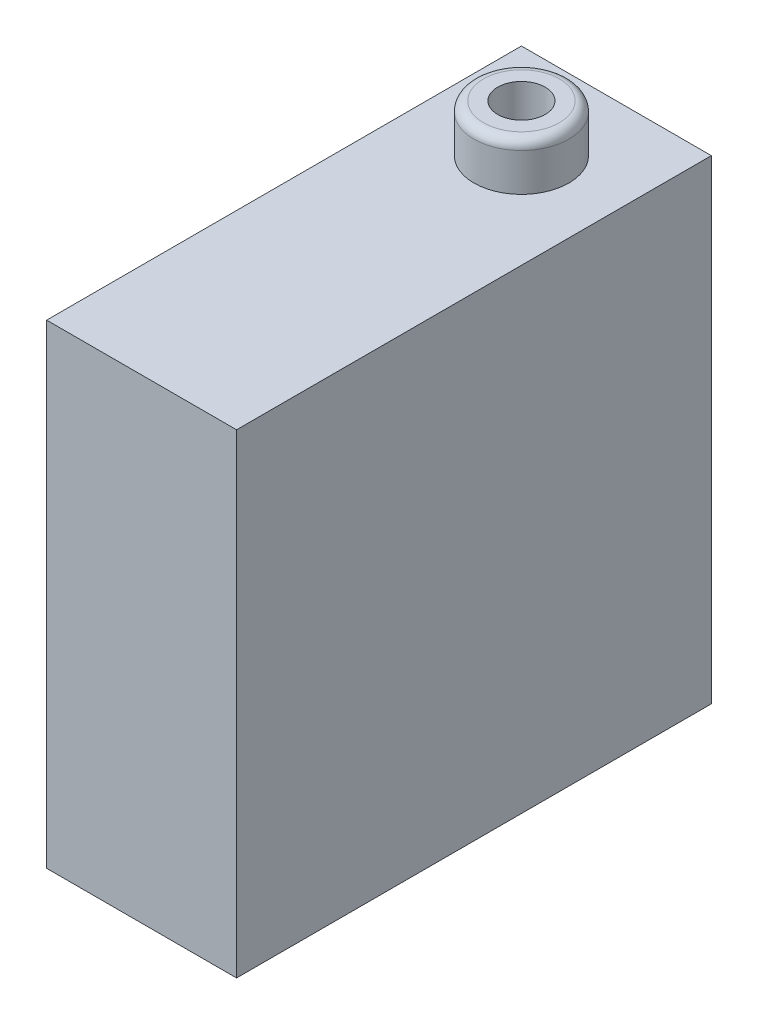
ISO-10303-21;
HEADER;
FILE_DESCRIPTION(('STEP AP214'),'2;1');
FILE_NAME('part.step','',(''),(''),'','','');
FILE_SCHEMA(('AUTOMOTIVE_DESIGN { 1 0 10303 214 1 1 1 1 }'));
ENDSEC;
DATA;
#1=APPLICATION_CONTEXT('core data for automotive mechanical design processes');
#2=APPLICATION_PROTOCOL_DEFINITION('international standard','automotive_design',2000,#1);
#3=PRODUCT_CONTEXT('',#1,'mechanical');
#4=PRODUCT('Part','Part','',(#3));
#5=PRODUCT_RELATED_PRODUCT_CATEGORY('part','',(#4));
#6=PRODUCT_DEFINITION_FORMATION('','',#4);
#7=PRODUCT_DEFINITION_CONTEXT('part definition',#1,'design');
#8=PRODUCT_DEFINITION('design','',#6,#7);
#9=PRODUCT_DEFINITION_SHAPE('','',#8);
#10=(LENGTH_UNIT() NAMED_UNIT(*) SI_UNIT(.MILLI.,.METRE.));
#11=(NAMED_UNIT(*) PLANE_ANGLE_UNIT() SI_UNIT($,.RADIAN.));
#12=(NAMED_UNIT(*) SI_UNIT($,.STERADIAN.) SOLID_ANGLE_UNIT());
#13=UNCERTAINTY_MEASURE_WITH_UNIT(LENGTH_MEASURE(1.E-05),#10,'distance_accuracy_value','');
#14=(GEOMETRIC_REPRESENTATION_CONTEXT(3) GLOBAL_UNCERTAINTY_ASSIGNED_CONTEXT((#13)) GLOBAL_UNIT_ASSIGNED_CONTEXT((#10,
#11,#12)) REPRESENTATION_CONTEXT('',''));
#15=CARTESIAN_POINT('',(0.,0.,0.));
#16=DIRECTION('',(0.,0.,1.));
#17=DIRECTION('',(1.,0.,0.));
#18=AXIS2_PLACEMENT_3D('',#15,#16,#17);
#19=CARTESIAN_POINT('',(0.,50.,0.));
#20=DIRECTION('',(0.,1.,0.));
#21=DIRECTION('',(0.,0.,1.));
#22=AXIS2_PLACEMENT_3D('',#19,#20,#21);
#23=PLANE('',#22);
#24=DIRECTION('',(0.,0.,1.));
#25=VECTOR('',#24,1.);
#26=CARTESIAN_POINT('',(-10.,50.,25.));
#27=LINE('',#26,#25);
#28=CARTESIAN_POINT('',(-10.,50.,-25.));
#29=VERTEX_POINT('',#28);
#30=CARTESIAN_POINT('',(-10.,50.,25.));
#31=VERTEX_POINT('',#30);
#32=EDGE_CURVE('E86',#29,#31,#27,.T.);
#33=ORIENTED_EDGE('',*,*,#32,.T.);
#34=DIRECTION('',(1.,0.,0.));
#35=VECTOR('',#34,1.);
#36=CARTESIAN_POINT('',(10.,50.,25.));
#37=LINE('',#36,#35);
#38=CARTESIAN_POINT('',(10.,50.,25.));
#39=VERTEX_POINT('',#38);
#40=EDGE_CURVE('E81',#31,#39,#37,.T.);
#41=ORIENTED_EDGE('',*,*,#40,.T.);
#42=DIRECTION('',(0.,0.,-1.));
#43=VECTOR('',#42,1.);
#44=CARTESIAN_POINT('',(10.,50.,25.));
#45=LINE('',#44,#43);
#46=CARTESIAN_POINT('',(10.,50.,-25.));
#47=VERTEX_POINT('',#46);
#48=EDGE_CURVE('E84',#39,#47,#45,.T.);
#49=ORIENTED_EDGE('',*,*,#48,.T.);
#50=DIRECTION('',(-1.,0.,0.));
#51=VECTOR('',#50,1.);
#52=CARTESIAN_POINT('',(10.,50.,-25.));
#53=LINE('',#52,#51);
#54=EDGE_CURVE('E50',#47,#29,#53,.T.);
#55=ORIENTED_EDGE('',*,*,#54,.T.);
#56=EDGE_LOOP('',(#33,#41,#49,#55));
#57=FACE_BOUND('',#56,.T.);
#58=CARTESIAN_POINT('',(0.,50.,-15.));
#59=DIRECTION('',(0.,1.,0.));
#60=DIRECTION('',(0.,0.,1.));
#61=AXIS2_PLACEMENT_3D('',#58,#59,#60);
#62=CIRCLE('',#61,5.);
#63=CARTESIAN_POINT('',(0.,50.,-10.));
#64=VERTEX_POINT('',#63);
#65=EDGE_CURVE('E104',#64,#64,#62,.T.);
#66=ORIENTED_EDGE('',*,*,#65,.F.);
#67=EDGE_LOOP('',(#66));
#68=FACE_BOUND('',#67,.T.);
#69=ADVANCED_FACE('F33',(#57,#68),#23,.T.);
#70=CARTESIAN_POINT('',(-10.,50.,25.));
#71=DIRECTION('',(1.,0.,0.));
#72=DIRECTION('',(0.,0.,-1.));
#73=AXIS2_PLACEMENT_3D('',#70,#71,#72);
#74=PLANE('',#73);
#75=DIRECTION('',(0.,0.,1.));
#76=VECTOR('',#75,1.);
#77=CARTESIAN_POINT('',(-10.,0.,25.));
#78=LINE('',#77,#76);
#79=CARTESIAN_POINT('',(-10.,0.,-25.));
#80=VERTEX_POINT('',#79);
#81=CARTESIAN_POINT('',(-10.,0.,25.));
#82=VERTEX_POINT('',#81);
#83=EDGE_CURVE('E101',#80,#82,#78,.T.);
#84=ORIENTED_EDGE('',*,*,#83,.T.);
#85=DIRECTION('',(0.,-1.,0.));
#86=VECTOR('',#85,1.);
#87=CARTESIAN_POINT('',(-10.,50.,25.));
#88=LINE('',#87,#86);
#89=EDGE_CURVE('E92',#31,#82,#88,.T.);
#90=ORIENTED_EDGE('',*,*,#89,.F.);
#91=ORIENTED_EDGE('',*,*,#32,.F.);
#92=DIRECTION('',(0.,-1.,0.));
#93=VECTOR('',#92,1.);
#94=CARTESIAN_POINT('',(-10.,50.,-25.));
#95=LINE('',#94,#93);
#96=EDGE_CURVE('E97',#29,#80,#95,.T.);
#97=ORIENTED_EDGE('',*,*,#96,.T.);
#98=EDGE_LOOP('',(#84,#90,#91,#97));
#99=FACE_BOUND('',#98,.T.);
#100=ADVANCED_FACE('F127',(#99),#74,.F.);
#101=CARTESIAN_POINT('',(10.,50.,25.));
#102=DIRECTION('',(0.,0.,-1.));
#103=DIRECTION('',(-1.,0.,0.));
#104=AXIS2_PLACEMENT_3D('',#101,#102,#103);
#105=PLANE('',#104);
#106=DIRECTION('',(1.,0.,0.));
#107=VECTOR('',#106,1.);
#108=CARTESIAN_POINT('',(10.,0.,25.));
#109=LINE('',#108,#107);
#110=CARTESIAN_POINT('',(10.,0.,25.));
#111=VERTEX_POINT('',#110);
#112=EDGE_CURVE('E91',#82,#111,#109,.T.);
#113=ORIENTED_EDGE('',*,*,#112,.T.);
#114=DIRECTION('',(0.,-1.,0.));
#115=VECTOR('',#114,1.);
#116=CARTESIAN_POINT('',(10.,50.,25.));
#117=LINE('',#116,#115);
#118=EDGE_CURVE('E89',#39,#111,#117,.T.);
#119=ORIENTED_EDGE('',*,*,#118,.F.);
#120=ORIENTED_EDGE('',*,*,#40,.F.);
#121=ORIENTED_EDGE('',*,*,#89,.T.);
#122=EDGE_LOOP('',(#113,#119,#120,#121));
#123=FACE_BOUND('',#122,.T.);
#124=ADVANCED_FACE('F90',(#123),#105,.F.);
#125=CARTESIAN_POINT('',(10.,50.,25.));
#126=DIRECTION('',(-1.,0.,0.));
#127=DIRECTION('',(0.,0.,1.));
#128=AXIS2_PLACEMENT_3D('',#125,#126,#127);
#129=PLANE('',#128);
#130=DIRECTION('',(0.,0.,-1.));
#131=VECTOR('',#130,1.);
#132=CARTESIAN_POINT('',(10.,0.,25.));
#133=LINE('',#132,#131);
#134=CARTESIAN_POINT('',(10.,0.,-25.));
#135=VERTEX_POINT('',#134);
#136=EDGE_CURVE('E67',#111,#135,#133,.T.);
#137=ORIENTED_EDGE('',*,*,#136,.T.);
#138=DIRECTION('',(0.,-1.,0.));
#139=VECTOR('',#138,1.);
#140=CARTESIAN_POINT('',(10.,50.,-25.));
#141=LINE('',#140,#139);
#142=EDGE_CURVE('E93',#47,#135,#141,.T.);
#143=ORIENTED_EDGE('',*,*,#142,.F.);
#144=ORIENTED_EDGE('',*,*,#48,.F.);
#145=ORIENTED_EDGE('',*,*,#118,.T.);
#146=EDGE_LOOP('',(#137,#143,#144,#145));
#147=FACE_BOUND('',#146,.T.);
#148=ADVANCED_FACE('F95',(#147),#129,.F.);
#149=CARTESIAN_POINT('',(10.,50.,-25.));
#150=DIRECTION('',(0.,0.,1.));
#151=DIRECTION('',(1.,0.,0.));
#152=AXIS2_PLACEMENT_3D('',#149,#150,#151);
#153=PLANE('',#152);
#154=DIRECTION('',(-1.,0.,0.));
#155=VECTOR('',#154,1.);
#156=CARTESIAN_POINT('',(10.,0.,-25.));
#157=LINE('',#156,#155);
#158=EDGE_CURVE('E73',#135,#80,#157,.T.);
#159=ORIENTED_EDGE('',*,*,#158,.T.);
#160=ORIENTED_EDGE('',*,*,#96,.F.);
#161=ORIENTED_EDGE('',*,*,#54,.F.);
#162=ORIENTED_EDGE('',*,*,#142,.T.);
#163=EDGE_LOOP('',(#159,#160,#161,#162));
#164=FACE_BOUND('',#163,.T.);
#165=ADVANCED_FACE('F140',(#164),#153,.F.);
#166=CARTESIAN_POINT('',(0.,0.,0.));
#167=DIRECTION('',(0.,1.,0.));
#168=DIRECTION('',(0.,0.,1.));
#169=AXIS2_PLACEMENT_3D('',#166,#167,#168);
#170=PLANE('',#169);
#171=ORIENTED_EDGE('',*,*,#83,.F.);
#172=ORIENTED_EDGE('',*,*,#158,.F.);
#173=ORIENTED_EDGE('',*,*,#136,.F.);
#174=ORIENTED_EDGE('',*,*,#112,.F.);
#175=EDGE_LOOP('',(#171,#172,#173,#174));
#176=FACE_BOUND('',#175,.T.);
#177=ADVANCED_FACE('F137',(#176),#170,.F.);
#178=CARTESIAN_POINT('',(0.,55.,-15.));
#179=DIRECTION('',(0.,-1.,0.));
#180=DIRECTION('',(0.,0.,-1.));
#181=AXIS2_PLACEMENT_3D('',#178,#179,#180);
#182=CYLINDRICAL_SURFACE('',#181,5.);
#183=CARTESIAN_POINT('',(0.,54.,-15.));
#184=DIRECTION('',(0.,1.,0.));
#185=DIRECTION('',(0.,0.,1.));
#186=AXIS2_PLACEMENT_3D('',#183,#184,#185);
#187=CIRCLE('',#186,5.);
#188=CARTESIAN_POINT('',(0.,54.,-10.));
#189=VERTEX_POINT('',#188);
#190=EDGE_CURVE('E11',#189,#189,#187,.F.);
#191=ORIENTED_EDGE('',*,*,#190,.T.);
#192=EDGE_LOOP('',(#191));
#193=FACE_BOUND('',#192,.T.);
#194=ORIENTED_EDGE('',*,*,#65,.T.);
#195=EDGE_LOOP('',(#194));
#196=FACE_BOUND('',#195,.T.);
#197=ADVANCED_FACE('F135',(#193,#196),#182,.T.);
#198=CARTESIAN_POINT('',(0.,55.,-15.));
#199=DIRECTION('',(0.,1.,0.));
#200=DIRECTION('',(0.,0.,1.));
#201=AXIS2_PLACEMENT_3D('',#198,#199,#200);
#202=PLANE('',#201);
#203=CARTESIAN_POINT('',(0.,55.,-15.));
#204=DIRECTION('',(0.,1.,0.));
#205=DIRECTION('',(0.,0.,1.));
#206=AXIS2_PLACEMENT_3D('',#203,#204,#205);
#207=CIRCLE('',#206,4.);
#208=CARTESIAN_POINT('',(0.,55.,-11.));
#209=VERTEX_POINT('',#208);
#210=EDGE_CURVE('E42',#209,#209,#207,.T.);
#211=ORIENTED_EDGE('',*,*,#210,.T.);
#212=EDGE_LOOP('',(#211));
#213=FACE_BOUND('',#212,.T.);
#214=CARTESIAN_POINT('',(0.,55.,-15.));
#215=DIRECTION('',(0.,1.,0.));
#216=DIRECTION('',(0.,0.,1.));
#217=AXIS2_PLACEMENT_3D('',#214,#215,#216);
#218=CIRCLE('',#217,2.5);
#219=CARTESIAN_POINT('',(0.,55.,-12.5));
#220=VERTEX_POINT('',#219);
#221=EDGE_CURVE('E221',#220,#220,#218,.T.);
#222=ORIENTED_EDGE('',*,*,#221,.F.);
#223=EDGE_LOOP('',(#222));
#224=FACE_BOUND('',#223,.T.);
#225=ADVANCED_FACE('F113',(#213,#224),#202,.T.);
#226=CARTESIAN_POINT('',(0.,50.,-15.));
#227=DIRECTION('',(0.,1.,0.));
#228=DIRECTION('',(0.,0.,1.));
#229=AXIS2_PLACEMENT_3D('',#226,#227,#228);
#230=CYLINDRICAL_SURFACE('',#229,2.5);
#231=CARTESIAN_POINT('',(0.,50.,-15.));
#232=DIRECTION('',(0.,1.,0.));
#233=DIRECTION('',(0.,0.,1.));
#234=AXIS2_PLACEMENT_3D('',#231,#232,#233);
#235=CIRCLE('',#234,2.5);
#236=CARTESIAN_POINT('',(0.,50.,-12.5));
#237=VERTEX_POINT('',#236);
#238=EDGE_CURVE('E218',#237,#237,#235,.T.);
#239=ORIENTED_EDGE('',*,*,#238,.F.);
#240=EDGE_LOOP('',(#239));
#241=FACE_BOUND('',#240,.T.);
#242=ORIENTED_EDGE('',*,*,#221,.T.);
#243=EDGE_LOOP('',(#242));
#244=FACE_BOUND('',#243,.T.);
#245=ADVANCED_FACE('F122',(#241,#244),#230,.F.);
#246=CARTESIAN_POINT('',(0.,50.,-15.));
#247=DIRECTION('',(0.,1.,0.));
#248=DIRECTION('',(0.,0.,1.));
#249=AXIS2_PLACEMENT_3D('',#246,#247,#248);
#250=PLANE('',#249);
#251=ORIENTED_EDGE('',*,*,#238,.T.);
#252=EDGE_LOOP('',(#251));
#253=FACE_BOUND('',#252,.T.);
#254=ADVANCED_FACE('F117',(#253),#250,.T.);
#255=CARTESIAN_POINT('',(0.,54.,-15.));
#256=DIRECTION('',(0.,1.,0.));
#257=DIRECTION('',(0.,0.,1.));
#258=AXIS2_PLACEMENT_3D('',#255,#256,#257);
#259=TOROIDAL_SURFACE('',#258,4.,1.);
#260=ORIENTED_EDGE('',*,*,#190,.F.);
#261=EDGE_LOOP('',(#260));
#262=FACE_BOUND('',#261,.T.);
#263=ORIENTED_EDGE('',*,*,#210,.F.);
#264=EDGE_LOOP('',(#263));
#265=FACE_BOUND('',#264,.T.);
#266=ADVANCED_FACE('F35',(#262,#265),#259,.T.);
#267=CLOSED_SHELL('',(#69,#100,#124,#148,#165,#177,#197,#225,#245,#254,#266));
#268=MANIFOLD_SOLID_BREP('B2',#267);
#269=ADVANCED_BREP_SHAPE_REPRESENTATION('',(#18,#268),#14);
#270=SHAPE_DEFINITION_REPRESENTATION(#9,#269);
ENDSEC;
END-ISO-10303-21;
